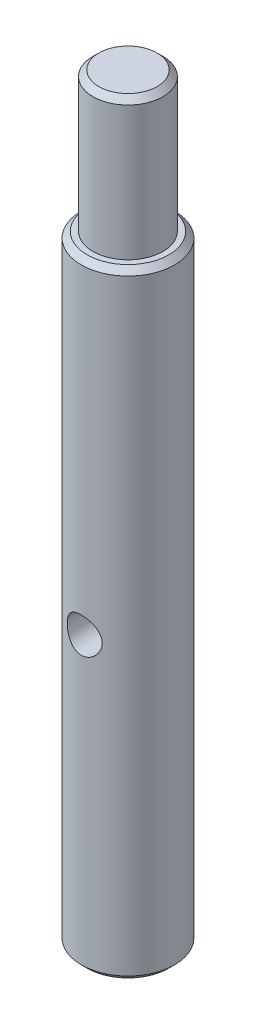
ISO-10303-21;
HEADER;
FILE_DESCRIPTION(('STEP AP214'),'2;1');
FILE_NAME('part.step','',(''),(''),'','','');
FILE_SCHEMA(('AUTOMOTIVE_DESIGN { 1 0 10303 214 1 1 1 1 }'));
ENDSEC;
DATA;
#1=APPLICATION_CONTEXT('core data for automotive mechanical design processes');
#2=APPLICATION_PROTOCOL_DEFINITION('international standard','automotive_design',2000,#1);
#3=PRODUCT_CONTEXT('',#1,'mechanical');
#4=PRODUCT('Part','Part','',(#3));
#5=PRODUCT_RELATED_PRODUCT_CATEGORY('part','',(#4));
#6=PRODUCT_DEFINITION_FORMATION('','',#4);
#7=PRODUCT_DEFINITION_CONTEXT('part definition',#1,'design');
#8=PRODUCT_DEFINITION('design','',#6,#7);
#9=PRODUCT_DEFINITION_SHAPE('','',#8);
#10=(LENGTH_UNIT() NAMED_UNIT(*) SI_UNIT(.MILLI.,.METRE.));
#11=(NAMED_UNIT(*) PLANE_ANGLE_UNIT() SI_UNIT($,.RADIAN.));
#12=(NAMED_UNIT(*) SI_UNIT($,.STERADIAN.) SOLID_ANGLE_UNIT());
#13=UNCERTAINTY_MEASURE_WITH_UNIT(LENGTH_MEASURE(1.E-05),#10,'distance_accuracy_value','');
#14=(GEOMETRIC_REPRESENTATION_CONTEXT(3) GLOBAL_UNCERTAINTY_ASSIGNED_CONTEXT((#13)) GLOBAL_UNIT_ASSIGNED_CONTEXT((#10,
#11,#12)) REPRESENTATION_CONTEXT('',''));
#15=CARTESIAN_POINT('',(0.,0.,0.));
#16=DIRECTION('',(0.,0.,1.));
#17=DIRECTION('',(1.,0.,0.));
#18=AXIS2_PLACEMENT_3D('',#15,#16,#17);
#19=CARTESIAN_POINT('',(0.,64.5,0.));
#20=DIRECTION('',(0.,1.,0.));
#21=DIRECTION('',(0.,0.,1.));
#22=AXIS2_PLACEMENT_3D('',#19,#20,#21);
#23=CYLINDRICAL_SURFACE('',#22,2.1);
#24=CARTESIAN_POINT('',(0.,53.,0.));
#25=DIRECTION('',(0.,1.,0.));
#26=DIRECTION('',(0.,0.,1.));
#27=AXIS2_PLACEMENT_3D('',#24,#25,#26);
#28=CIRCLE('',#27,2.1);
#29=CARTESIAN_POINT('',(0.,53.,2.1));
#30=VERTEX_POINT('',#29);
#31=EDGE_CURVE('P0_E20',#30,#30,#28,.T.);
#32=ORIENTED_EDGE('',*,*,#31,.T.);
#33=EDGE_LOOP('',(#32));
#34=FACE_BOUND('',#33,.T.);
#35=CARTESIAN_POINT('',(0.,64.5,0.));
#36=DIRECTION('',(0.,1.,0.));
#37=DIRECTION('',(0.,0.,1.));
#38=AXIS2_PLACEMENT_3D('',#35,#36,#37);
#39=CIRCLE('',#38,2.1);
#40=CARTESIAN_POINT('',(0.,64.5,2.1));
#41=VERTEX_POINT('',#40);
#42=EDGE_CURVE('P0_E11',#41,#41,#39,.F.);
#43=ORIENTED_EDGE('',*,*,#42,.T.);
#44=EDGE_LOOP('',(#43));
#45=FACE_BOUND('',#44,.T.);
#46=ADVANCED_FACE('P0_F16',(#34,#45),#23,.T.);
#47=CARTESIAN_POINT('',(0.,64.5,0.));
#48=DIRECTION('',(0.,1.,0.));
#49=DIRECTION('',(0.,0.,1.));
#50=AXIS2_PLACEMENT_3D('',#47,#48,#49);
#51=PLANE('',#50);
#52=ORIENTED_EDGE('',*,*,#42,.F.);
#53=EDGE_LOOP('',(#52));
#54=FACE_BOUND('',#53,.T.);
#55=CARTESIAN_POINT('',(-3.,64.5,0.));
#56=CARTESIAN_POINT('',(-2.99979758483912,64.5,0.572474592040133));
#57=CARTESIAN_POINT('',(-2.78936490318729,64.5,1.10428412868562));
#58=CARTESIAN_POINT('',(-2.56095382781985,64.5,1.68152900910221));
#59=CARTESIAN_POINT('',(-2.12132034355964,64.5,2.12132034355964));
#60=CARTESIAN_POINT('',(-1.68243191582807,64.5,2.56036635397624));
#61=CARTESIAN_POINT('',(-1.10428412868562,64.5,2.78936490318729));
#62=CARTESIAN_POINT('',(-0.572753802134978,64.5,2.99989874306132));
#63=CARTESIAN_POINT('',(0.,64.5,3.));
#64=CARTESIAN_POINT('',(0.571707613467384,64.5,3.00010107198336));
#65=CARTESIAN_POINT('',(1.10428412868562,64.5,2.78936490318729));
#66=CARTESIAN_POINT('',(1.68152900910127,64.5,2.56095382782079));
#67=CARTESIAN_POINT('',(2.12132034355964,64.5,2.12132034355964));
#68=CARTESIAN_POINT('',(2.56036635397624,64.5,1.68243191582807));
#69=CARTESIAN_POINT('',(2.78936490318729,64.5,1.10428412868562));
#70=CARTESIAN_POINT('',(2.999797395646,64.5,0.573009671807972));
#71=CARTESIAN_POINT('',(3.,64.5,0.));
#72=B_SPLINE_CURVE_WITH_KNOTS('',2,(#55,#56,#57,#58,#59,#60,#61,#62,#63,#64,#65,#66,#67,#68,#69,
#70,#71),.UNSPECIFIED.,.F.,.F.,(3,2,2,2,2,2,2,2,3),(0.,0.125,0.25,0.375,0.5,0.625,0.75,0.875,
1.),.UNSPECIFIED.);
#73=CARTESIAN_POINT('',(-3.,64.5,0.));
#74=VERTEX_POINT('',#73);
#75=CARTESIAN_POINT('',(3.,64.5,0.));
#76=VERTEX_POINT('',#75);
#77=EDGE_CURVE('P0_E29',#74,#76,#72,.T.);
#78=ORIENTED_EDGE('',*,*,#77,.F.);
#79=CARTESIAN_POINT('',(3.,64.5,0.));
#80=CARTESIAN_POINT('',(2.99979758483912,64.5,-0.572474592040133));
#81=CARTESIAN_POINT('',(2.78936490318729,64.5,-1.10428412868562));
#82=CARTESIAN_POINT('',(2.56095382781985,64.5,-1.68152900910221));
#83=CARTESIAN_POINT('',(2.12132034355964,64.5,-2.12132034355964));
#84=CARTESIAN_POINT('',(1.68243191582807,64.5,-2.56036635397624));
#85=CARTESIAN_POINT('',(1.10428412868562,64.5,-2.78936490318729));
#86=CARTESIAN_POINT('',(0.572753802134978,64.5,-2.99989874306132));
#87=CARTESIAN_POINT('',(0.,64.5,-3.));
#88=CARTESIAN_POINT('',(-0.571707613467384,64.5,-3.00010107198336));
#89=CARTESIAN_POINT('',(-1.10428412868562,64.5,-2.78936490318729));
#90=CARTESIAN_POINT('',(-1.68152900910127,64.5,-2.56095382782079));
#91=CARTESIAN_POINT('',(-2.12132034355964,64.5,-2.12132034355964));
#92=CARTESIAN_POINT('',(-2.56036635397624,64.5,-1.68243191582807));
#93=CARTESIAN_POINT('',(-2.78936490318729,64.5,-1.10428412868562));
#94=CARTESIAN_POINT('',(-2.999797395646,64.5,-0.573009671807972));
#95=CARTESIAN_POINT('',(-3.,64.5,0.));
#96=B_SPLINE_CURVE_WITH_KNOTS('',2,(#79,#80,#81,#82,#83,#84,#85,#86,#87,#88,#89,#90,#91,#92,#93,
#94,#95),.UNSPECIFIED.,.F.,.F.,(3,2,2,2,2,2,2,2,3),(0.,0.125,0.25,0.375,0.5,0.625,0.75,0.875,
1.),.UNSPECIFIED.);
#97=EDGE_CURVE('P0_E48',#76,#74,#96,.T.);
#98=ORIENTED_EDGE('',*,*,#97,.F.);
#99=EDGE_LOOP('',(#78,#98));
#100=FACE_BOUND('',#99,.T.);
#101=ADVANCED_FACE('P0_F67',(#54,#100),#51,.F.);
#102=CARTESIAN_POINT('',(0.,53.,0.));
#103=DIRECTION('',(0.,1.,0.));
#104=DIRECTION('',(0.,0.,1.));
#105=AXIS2_PLACEMENT_3D('',#102,#103,#104);
#106=PLANE('',#105);
#107=ORIENTED_EDGE('',*,*,#31,.F.);
#108=EDGE_LOOP('',(#107));
#109=FACE_BOUND('',#108,.T.);
#110=CARTESIAN_POINT('',(3.,53.,0.));
#111=CARTESIAN_POINT('',(2.99979758483912,53.,-0.572474592038812));
#112=CARTESIAN_POINT('',(2.78936490318729,53.,-1.10428412868562));
#113=CARTESIAN_POINT('',(2.56095382782096,53.,-1.68152900910086));
#114=CARTESIAN_POINT('',(2.12132034355964,53.,-2.12132034355964));
#115=CARTESIAN_POINT('',(1.68243191582797,53.,-2.56036635397659));
#116=CARTESIAN_POINT('',(1.10428412868562,53.,-2.78936490318729));
#117=CARTESIAN_POINT('',(0.572753802134251,53.,-2.99989874306132));
#118=CARTESIAN_POINT('',(0.,53.,-3.));
#119=CARTESIAN_POINT('',(-0.571707613467504,53.,-3.00010107198336));
#120=CARTESIAN_POINT('',(-1.10428412868562,53.,-2.78936490318729));
#121=CARTESIAN_POINT('',(-1.68152900910094,53.,-2.56095382782087));
#122=CARTESIAN_POINT('',(-2.12132034355964,53.,-2.12132034355964));
#123=CARTESIAN_POINT('',(-2.56036635397764,53.,-1.68243191582692));
#124=CARTESIAN_POINT('',(-2.78936490318729,53.,-1.10428412868562));
#125=CARTESIAN_POINT('',(-2.999797395646,53.,-0.573009671805779));
#126=CARTESIAN_POINT('',(-3.,53.,0.));
#127=B_SPLINE_CURVE_WITH_KNOTS('',2,(#110,#111,#112,#113,#114,#115,#116,#117,#118,#119,#120,
#121,#122,#123,#124,#125,#126),.UNSPECIFIED.,.F.,.F.,(3,2,2,2,2,2,2,2,3),(0.,0.125,0.25,0.375,
0.5,0.625,0.75,0.875,1.),.UNSPECIFIED.);
#128=CARTESIAN_POINT('',(3.,53.,0.));
#129=VERTEX_POINT('',#128);
#130=CARTESIAN_POINT('',(-3.,53.,0.));
#131=VERTEX_POINT('',#130);
#132=EDGE_CURVE('P0_E35',#129,#131,#127,.T.);
#133=ORIENTED_EDGE('',*,*,#132,.T.);
#134=CARTESIAN_POINT('',(-3.,53.,0.));
#135=CARTESIAN_POINT('',(-2.99979758483912,53.,0.572474592038812));
#136=CARTESIAN_POINT('',(-2.78936490318729,53.,1.10428412868562));
#137=CARTESIAN_POINT('',(-2.56095382782096,53.,1.68152900910086));
#138=CARTESIAN_POINT('',(-2.12132034355964,53.,2.12132034355964));
#139=CARTESIAN_POINT('',(-1.68243191582797,53.,2.56036635397659));
#140=CARTESIAN_POINT('',(-1.10428412868562,53.,2.78936490318729));
#141=CARTESIAN_POINT('',(-0.572753802134251,53.,2.99989874306132));
#142=CARTESIAN_POINT('',(0.,53.,3.));
#143=CARTESIAN_POINT('',(0.571707613467504,53.,3.00010107198336));
#144=CARTESIAN_POINT('',(1.10428412868562,53.,2.78936490318729));
#145=CARTESIAN_POINT('',(1.68152900910094,53.,2.56095382782087));
#146=CARTESIAN_POINT('',(2.12132034355964,53.,2.12132034355964));
#147=CARTESIAN_POINT('',(2.56036635397764,53.,1.68243191582692));
#148=CARTESIAN_POINT('',(2.78936490318729,53.,1.10428412868562));
#149=CARTESIAN_POINT('',(2.999797395646,53.,0.573009671805779));
#150=CARTESIAN_POINT('',(3.,53.,0.));
#151=B_SPLINE_CURVE_WITH_KNOTS('',2,(#134,#135,#136,#137,#138,#139,#140,#141,#142,#143,#144,
#145,#146,#147,#148,#149,#150),.UNSPECIFIED.,.F.,.F.,(3,2,2,2,2,2,2,2,3),(0.,0.125,0.25,0.375,
0.5,0.625,0.75,0.875,1.),.UNSPECIFIED.);
#152=EDGE_CURVE('P0_E39',#131,#129,#151,.T.);
#153=ORIENTED_EDGE('',*,*,#152,.T.);
#154=EDGE_LOOP('',(#133,#153));
#155=FACE_BOUND('',#154,.T.);
#156=ADVANCED_FACE('P0_F17',(#109,#155),#106,.T.);
#157=OPEN_SHELL('',(#46,#101,#156));
#158=SHELL_BASED_SURFACE_MODEL('P0_B1',(#157));
#159=CARTESIAN_POINT('',(0.,65.,0.));
#160=DIRECTION('',(0.,1.,0.));
#161=DIRECTION('',(0.,0.,1.));
#162=AXIS2_PLACEMENT_3D('',#159,#160,#161);
#163=PLANE('',#162);
#164=CARTESIAN_POINT('',(0.,64.9999999999409,0.));
#165=DIRECTION('',(0.,-1.,0.));
#166=DIRECTION('',(0.,0.,-1.));
#167=AXIS2_PLACEMENT_3D('',#164,#165,#166);
#168=CIRCLE('',#167,2.49999999999773);
#169=CARTESIAN_POINT('',(0.,64.9999999999409,-2.49999999999773));
#170=VERTEX_POINT('',#169);
#171=EDGE_CURVE('P1_E19',#170,#170,#168,.T.);
#172=ORIENTED_EDGE('',*,*,#171,.F.);
#173=EDGE_LOOP('',(#172));
#174=FACE_BOUND('',#173,.T.);
#175=ADVANCED_FACE('P1_F16',(#174),#163,.T.);
#176=CARTESIAN_POINT('',(0.,10.0999999999658,0.));
#177=DIRECTION('',(0.,-1.,0.));
#178=DIRECTION('',(0.,0.,-1.));
#179=AXIS2_PLACEMENT_3D('',#176,#177,#178);
#180=CONICAL_SURFACE('',#179,2.24999999994679,1.02974425867671);
#181=CARTESIAN_POINT('',(0.,10.1,0.));
#182=DIRECTION('',(0.,-1.,0.));
#183=DIRECTION('',(0.,0.,-1.));
#184=AXIS2_PLACEMENT_3D('',#181,#182,#183);
#185=CIRCLE('',#184,2.25);
#186=CARTESIAN_POINT('',(0.,10.1,-2.25));
#187=VERTEX_POINT('',#186);
#188=EDGE_CURVE('P1_E82',#187,#187,#185,.T.);
#189=ORIENTED_EDGE('',*,*,#188,.T.);
#190=EDGE_LOOP('',(#189));
#191=FACE_BOUND('',#190,.T.);
#192=CARTESIAN_POINT('',(-5.6843418860808E-11,11.4519363927741,0.));
#193=VERTEX_POINT('',#192);
#194=VERTEX_LOOP('',#193);
#195=FACE_BOUND('',#194,.T.);
#196=ADVANCED_FACE('P1_F27',(#191,#195),#180,.F.);
#197=CARTESIAN_POINT('',(0.,64.5000000000095,0.));
#198=DIRECTION('',(0.,-1.,0.));
#199=DIRECTION('',(0.,0.,-1.));
#200=AXIS2_PLACEMENT_3D('',#197,#198,#199);
#201=CONICAL_SURFACE('',#200,2.99999999992906,0.785398163397448);
#202=CARTESIAN_POINT('',(0.,64.5,0.));
#203=DIRECTION('',(0.,1.,0.));
#204=DIRECTION('',(0.,0.,1.));
#205=AXIS2_PLACEMENT_3D('',#202,#203,#204);
#206=CIRCLE('',#205,3.);
#207=CARTESIAN_POINT('',(0.,64.5,3.));
#208=VERTEX_POINT('',#207);
#209=EDGE_CURVE('P1_E78',#208,#208,#206,.F.);
#210=ORIENTED_EDGE('',*,*,#209,.F.);
#211=EDGE_LOOP('',(#210));
#212=FACE_BOUND('',#211,.T.);
#213=ORIENTED_EDGE('',*,*,#171,.T.);
#214=EDGE_LOOP('',(#213));
#215=FACE_BOUND('',#214,.T.);
#216=ADVANCED_FACE('P1_F29',(#212,#215),#201,.T.);
#217=CARTESIAN_POINT('',(0.,12.02453321245,0.));
#218=DIRECTION('',(0.,-1.,0.));
#219=DIRECTION('',(0.,0.,-1.));
#220=AXIS2_PLACEMENT_3D('',#217,#218,#219);
#221=CYLINDRICAL_SURFACE('',#220,2.25);
#222=ORIENTED_EDGE('',*,*,#188,.F.);
#223=EDGE_LOOP('',(#222));
#224=FACE_BOUND('',#223,.T.);
#225=CARTESIAN_POINT('',(0.,0.,0.));
#226=DIRECTION('',(0.,-1.,0.));
#227=DIRECTION('',(0.,0.,-1.));
#228=AXIS2_PLACEMENT_3D('',#225,#226,#227);
#229=CIRCLE('',#228,2.25);
#230=CARTESIAN_POINT('',(0.,0.,-2.25));
#231=VERTEX_POINT('',#230);
#232=EDGE_CURVE('P1_E76',#231,#231,#229,.T.);
#233=ORIENTED_EDGE('',*,*,#232,.T.);
#234=EDGE_LOOP('',(#233));
#235=FACE_BOUND('',#234,.T.);
#236=ADVANCED_FACE('P1_F36',(#224,#235),#221,.F.);
#237=CARTESIAN_POINT('',(0.,65.,0.));
#238=DIRECTION('',(0.,1.,0.));
#239=DIRECTION('',(0.,0.,1.));
#240=AXIS2_PLACEMENT_3D('',#237,#238,#239);
#241=CYLINDRICAL_SURFACE('',#240,3.);
#242=CARTESIAN_POINT('',(0.,53.,0.));
#243=DIRECTION('',(0.,1.,0.));
#244=DIRECTION('',(0.,0.,1.));
#245=AXIS2_PLACEMENT_3D('',#242,#243,#244);
#246=CIRCLE('',#245,3.);
#247=CARTESIAN_POINT('',(0.,53.,3.));
#248=VERTEX_POINT('',#247);
#249=EDGE_CURVE('P1_E74',#248,#248,#246,.F.);
#250=ORIENTED_EDGE('',*,*,#249,.F.);
#251=EDGE_LOOP('',(#250));
#252=FACE_BOUND('',#251,.T.);
#253=ORIENTED_EDGE('',*,*,#209,.T.);
#254=EDGE_LOOP('',(#253));
#255=FACE_BOUND('',#254,.T.);
#256=ADVANCED_FACE('P1_F100',(#252,#255),#241,.T.);
#257=CARTESIAN_POINT('',(0.,0.,0.));
#258=DIRECTION('',(0.,1.,0.));
#259=DIRECTION('',(0.,0.,1.));
#260=AXIS2_PLACEMENT_3D('',#257,#258,#259);
#261=PLANE('',#260);
#262=ORIENTED_EDGE('',*,*,#232,.F.);
#263=EDGE_LOOP('',(#262));
#264=FACE_BOUND('',#263,.T.);
#265=CARTESIAN_POINT('',(0.,5.6843418860808E-11,0.));
#266=DIRECTION('',(0.,1.,0.));
#267=DIRECTION('',(0.,0.,1.));
#268=AXIS2_PLACEMENT_3D('',#265,#266,#267);
#269=CIRCLE('',#268,3.50000000008777);
#270=CARTESIAN_POINT('',(0.,5.6843418860808E-11,3.50000000008777));
#271=VERTEX_POINT('',#270);
#272=EDGE_CURVE('P1_E71',#271,#271,#269,.T.);
#273=ORIENTED_EDGE('',*,*,#272,.F.);
#274=EDGE_LOOP('',(#273));
#275=FACE_BOUND('',#274,.T.);
#276=ADVANCED_FACE('P1_F98',(#264,#275),#261,.F.);
#277=CARTESIAN_POINT('',(0.,53.,0.));
#278=DIRECTION('',(0.,1.,0.));
#279=DIRECTION('',(0.,0.,1.));
#280=AXIS2_PLACEMENT_3D('',#277,#278,#279);
#281=PLANE('',#280);
#282=ORIENTED_EDGE('',*,*,#249,.T.);
#283=EDGE_LOOP('',(#282));
#284=FACE_BOUND('',#283,.T.);
#285=CARTESIAN_POINT('',(0.,52.9999999999973,0.));
#286=DIRECTION('',(0.,-1.,0.));
#287=DIRECTION('',(0.,0.,-1.));
#288=AXIS2_PLACEMENT_3D('',#285,#286,#287);
#289=CIRCLE('',#288,3.50000000003092);
#290=CARTESIAN_POINT('',(0.,52.9999999999973,-3.50000000003092));
#291=VERTEX_POINT('',#290);
#292=EDGE_CURVE('P1_E68',#291,#291,#289,.T.);
#293=ORIENTED_EDGE('',*,*,#292,.F.);
#294=EDGE_LOOP('',(#293));
#295=FACE_BOUND('',#294,.T.);
#296=ADVANCED_FACE('P1_F94',(#284,#295),#281,.T.);
#297=CARTESIAN_POINT('',(0.,0.499999998851308,0.));
#298=DIRECTION('',(0.,1.,0.));
#299=DIRECTION('',(0.,0.,1.));
#300=AXIS2_PLACEMENT_3D('',#297,#298,#299);
#301=CONICAL_SURFACE('',#300,3.99999999888223,0.785398163397448);
#302=CARTESIAN_POINT('',(0.,0.4999999989309,0.));
#303=DIRECTION('',(0.,1.,0.));
#304=DIRECTION('',(0.,0.,1.));
#305=AXIS2_PLACEMENT_3D('',#302,#303,#304);
#306=CIRCLE('',#305,4.);
#307=CARTESIAN_POINT('',(0.,0.4999999989309,4.));
#308=VERTEX_POINT('',#307);
#309=EDGE_CURVE('P1_E67',#308,#308,#306,.T.);
#310=ORIENTED_EDGE('',*,*,#309,.F.);
#311=EDGE_LOOP('',(#310));
#312=FACE_BOUND('',#311,.T.);
#313=ORIENTED_EDGE('',*,*,#272,.T.);
#314=EDGE_LOOP('',(#313));
#315=FACE_BOUND('',#314,.T.);
#316=ADVANCED_FACE('P1_F91',(#312,#315),#301,.T.);
#317=CARTESIAN_POINT('',(0.,52.5000000001228,0.));
#318=DIRECTION('',(0.,-1.,0.));
#319=DIRECTION('',(0.,0.,-1.));
#320=AXIS2_PLACEMENT_3D('',#317,#318,#319);
#321=CONICAL_SURFACE('',#320,3.99999999990541,0.785398163397448);
#322=ORIENTED_EDGE('',*,*,#292,.T.);
#323=EDGE_LOOP('',(#322));
#324=FACE_BOUND('',#323,.T.);
#325=CARTESIAN_POINT('',(0.,52.5,0.));
#326=DIRECTION('',(0.,1.,0.));
#327=DIRECTION('',(0.,0.,1.));
#328=AXIS2_PLACEMENT_3D('',#325,#326,#327);
#329=CIRCLE('',#328,4.);
#330=CARTESIAN_POINT('',(0.,52.5,4.));
#331=VERTEX_POINT('',#330);
#332=EDGE_CURVE('P1_E23',#331,#331,#329,.F.);
#333=ORIENTED_EDGE('',*,*,#332,.F.);
#334=EDGE_LOOP('',(#333));
#335=FACE_BOUND('',#334,.T.);
#336=ADVANCED_FACE('P1_F49',(#324,#335),#321,.T.);
#337=CARTESIAN_POINT('',(0.,25.,4.));
#338=DIRECTION('',(0.,0.,-1.));
#339=DIRECTION('',(-1.,0.,0.));
#340=AXIS2_PLACEMENT_3D('',#337,#338,#339);
#341=CYLINDRICAL_SURFACE('',#340,1.5);
#342=CARTESIAN_POINT('',(-1.5,25.,3.70809924354783));
#343=CARTESIAN_POINT('',(-1.49999511198562,25.0808856815842,3.70810390468995));
#344=CARTESIAN_POINT('',(-1.49342462043817,25.1618484052092,3.71078017486277));
#345=CARTESIAN_POINT('',(-1.46739553122329,25.321415586283,3.72114716574756));
#346=CARTESIAN_POINT('',(-1.44791647247549,25.4000160923335,3.72884584706871));
#347=CARTESIAN_POINT('',(-1.39689210182249,25.5523831089441,3.74825681504278));
#348=CARTESIAN_POINT('',(-1.36538366315583,25.6261635926785,3.75995682525136));
#349=CARTESIAN_POINT('',(-1.29130569359819,25.7673936044528,3.78603559884647));
#350=CARTESIAN_POINT('',(-1.24873621383727,25.8348431617557,3.80041434985032));
#351=CARTESIAN_POINT('',(-1.1514676407667,25.964888573723,3.83103545050313));
#352=CARTESIAN_POINT('',(-1.09630616188792,26.0271257844757,3.84733273300532));
#353=CARTESIAN_POINT('',(-0.976398614974301,26.1417206621388,3.87949681773074));
#354=CARTESIAN_POINT('',(-0.911650100405856,26.1940757994436,3.89536350884397));
#355=CARTESIAN_POINT('',(-0.771694621328188,26.2891395101715,3.92552874918008));
#356=CARTESIAN_POINT('',(-0.696206884645209,26.3314595033803,3.93975562475051));
#357=CARTESIAN_POINT('',(-0.538555706333357,26.402651201907,3.9643800872777));
#358=CARTESIAN_POINT('',(-0.456394597048803,26.431527582218,3.97477900513638));
#359=CARTESIAN_POINT('',(-0.291489314135701,26.4737579013459,3.9901869737988));
#360=CARTESIAN_POINT('',(-0.208923141284651,26.4877276368241,3.99540915570892));
#361=CARTESIAN_POINT('',(-0.0424643069478187,26.5017212010518,4.00064014106762));
#362=CARTESIAN_POINT('',(0.0414279133905617,26.5017495740492,4.00065064328596));
#363=CARTESIAN_POINT('',(0.203743429413647,26.4882182491575,3.99559266256176));
#364=CARTESIAN_POINT('',(0.282231952477409,26.4753307436436,3.99077543371971));
#365=CARTESIAN_POINT('',(0.435839001660108,26.4374641521752,3.97693277540875));
#366=CARTESIAN_POINT('',(0.510957279027463,26.4124841752968,3.96790703587578));
#367=CARTESIAN_POINT('',(0.656990622215187,26.3508288874906,3.94637745432581));
#368=CARTESIAN_POINT('',(0.72782848402618,26.3139884496949,3.93382484396379));
#369=CARTESIAN_POINT('',(0.862489409870148,26.2298057634355,3.90651245754908));
#370=CARTESIAN_POINT('',(0.92631050913665,26.1824605846788,3.8917520660119));
#371=CARTESIAN_POINT('',(1.04908093630972,26.0753812874176,3.86052771527365));
#372=CARTESIAN_POINT('',(1.1075284050676,26.0150853054084,3.84401460840428));
#373=CARTESIAN_POINT('',(1.21368958697561,25.8854270031139,3.81182937208832));
#374=CARTESIAN_POINT('',(1.26139735324323,25.816059693215,3.79615771221437));
#375=CARTESIAN_POINT('',(1.34568993912002,25.6682245048253,3.76711519922767));
#376=CARTESIAN_POINT('',(1.38199556964104,25.589584842883,3.75380512939464));
#377=CARTESIAN_POINT('',(1.44060169661363,25.4267540711373,3.73171052411887));
#378=CARTESIAN_POINT('',(1.46293219796961,25.342575286695,3.72291630039947));
#379=CARTESIAN_POINT('',(1.48518920410794,25.214638944686,3.71406329828307));
#380=CARTESIAN_POINT('',(1.49073488518211,25.1719380994954,3.71183587263098));
#381=CARTESIAN_POINT('',(1.49814158486026,25.0861654588583,3.7088526037461));
#382=CARTESIAN_POINT('',(1.50000260419944,25.0430936634857,3.70809676021968));
#383=CARTESIAN_POINT('',(1.49999511198562,24.9191143184158,3.70810390468995));
#384=CARTESIAN_POINT('',(1.49342462043817,24.8381515947908,3.71078017486277));
#385=CARTESIAN_POINT('',(1.46739553122329,24.678584413717,3.72114716574756));
#386=CARTESIAN_POINT('',(1.44791647247549,24.5999839076665,3.72884584706871));
#387=CARTESIAN_POINT('',(1.39689210182249,24.4476168910559,3.74825681504278));
#388=CARTESIAN_POINT('',(1.36538366315583,24.3738364073215,3.75995682525136));
#389=CARTESIAN_POINT('',(1.29130569359818,24.2326063955472,3.78603559884647));
#390=CARTESIAN_POINT('',(1.24873621383727,24.1651568382443,3.80041434985032));
#391=CARTESIAN_POINT('',(1.1514676407667,24.035111426277,3.83103545050313));
#392=CARTESIAN_POINT('',(1.09630616188792,23.9728742155243,3.84733273300532));
#393=CARTESIAN_POINT('',(0.976398614974301,23.8582793378612,3.87949681773074));
#394=CARTESIAN_POINT('',(0.911650100405855,23.8059242005564,3.89536350884397));
#395=CARTESIAN_POINT('',(0.771694621328188,23.7108604898285,3.92552874918008));
#396=CARTESIAN_POINT('',(0.696206884645209,23.6685404966197,3.93975562475051));
#397=CARTESIAN_POINT('',(0.538555706333356,23.597348798093,3.9643800872777));
#398=CARTESIAN_POINT('',(0.456394597048802,23.568472417782,3.97477900513638));
#399=CARTESIAN_POINT('',(0.291489314135701,23.5262420986541,3.9901869737988));
#400=CARTESIAN_POINT('',(0.208923141284651,23.5122723631759,3.99540915570892));
#401=CARTESIAN_POINT('',(0.0424643069478187,23.4982787989482,4.00064014106762));
#402=CARTESIAN_POINT('',(-0.0414279133905617,23.4982504259508,4.00065064328596));
#403=CARTESIAN_POINT('',(-0.203743429413647,23.5117817508425,3.99559266256176));
#404=CARTESIAN_POINT('',(-0.282231952477409,23.5246692563564,3.99077543371971));
#405=CARTESIAN_POINT('',(-0.435839001660108,23.5625358478248,3.97693277540875));
#406=CARTESIAN_POINT('',(-0.510957279027463,23.5875158247032,3.96790703587578));
#407=CARTESIAN_POINT('',(-0.656990622215187,23.6491711125094,3.94637745432581));
#408=CARTESIAN_POINT('',(-0.727828484026181,23.6860115503051,3.93382484396378));
#409=CARTESIAN_POINT('',(-0.862489409870149,23.7701942365645,3.90651245754908));
#410=CARTESIAN_POINT('',(-0.926310509136651,23.8175394153212,3.8917520660119));
#411=CARTESIAN_POINT('',(-1.04908093630972,23.9246187125824,3.86052771527365));
#412=CARTESIAN_POINT('',(-1.1075284050676,23.9849146945916,3.84401460840428));
#413=CARTESIAN_POINT('',(-1.21368958697561,24.1145729968861,3.81182937208832));
#414=CARTESIAN_POINT('',(-1.26139735324323,24.183940306785,3.79615771221437));
#415=CARTESIAN_POINT('',(-1.34568993912002,24.3317754951747,3.76711519922767));
#416=CARTESIAN_POINT('',(-1.38199556964104,24.410415157117,3.75380512939463));
#417=CARTESIAN_POINT('',(-1.44060169661363,24.5732459288627,3.73171052411887));
#418=CARTESIAN_POINT('',(-1.46293219796961,24.6574247133051,3.72291630039947));
#419=CARTESIAN_POINT('',(-1.48518920410794,24.785361055314,3.71406329828307));
#420=CARTESIAN_POINT('',(-1.49073488518211,24.8280619005046,3.71183587263098));
#421=CARTESIAN_POINT('',(-1.49814158486026,24.9138345411417,3.7088526037461));
#422=CARTESIAN_POINT('',(-1.50000260419944,24.9569063365143,3.70809676021968));
#423=CARTESIAN_POINT('',(-1.5,25.,3.70809924354783));
#424=B_SPLINE_CURVE_WITH_KNOTS('',3,(#342,#343,#344,#345,#346,#347,#348,#349,#350,#351,#352,
#353,#354,#355,#356,#357,#358,#359,#360,#361,#362,#363,#364,#365,#366,#367,#368,#369,#370,#371,
#372,#373,#374,#375,#376,#377,#378,#379,#380,#381,#382,#383,#384,#385,#386,#387,#388,#389,#390,
#391,#392,#393,#394,#395,#396,#397,#398,#399,#400,#401,#402,#403,#404,#405,#406,#407,#408,#409,
#410,#411,#412,#413,#414,#415,#416,#417,#418,#419,#420,#421,#422,#423),.UNSPECIFIED.,.T.,.F.,(4,
2,2,2,2,2,2,2,2,2,2,2,2,2,2,2,2,2,2,2,2,2,2,2,2,2,2,2,2,2,2,2,2,2,2,2,2,2,2,2,4),(0.,
0.242488275572684,0.485361836176221,0.727496825725533,0.969630696016732,1.2227411485105,
1.47591630441611,1.73770084383829,1.99939428001787,2.24980028562969,2.50012467025743,
2.73806440302077,2.97602166888029,3.21744659529709,3.45893895195248,3.71452823140489,
3.9702586917696,4.23183490868752,4.49284757156316,4.62203867222691,4.75122974711301,
4.9937180226857,5.23659158328924,5.47872657283855,5.72086044312975,5.97397089562352,
6.22714605152912,6.4889305909513,6.75062402713088,7.0010300327427,7.25135441737044,
7.48929415013378,7.7272514159933,7.96867634241011,8.21016869906549,8.4657579785179,
8.72148843888261,8.98306465580054,9.24407731867618,9.37326841933992,9.50245949422603),.UNSPECIFIED.);
#425=CARTESIAN_POINT('',(-1.5,25.,3.70809924354783));
#426=VERTEX_POINT('',#425);
#427=EDGE_CURVE('P1_E62',#426,#426,#424,.T.);
#428=ORIENTED_EDGE('',*,*,#427,.F.);
#429=EDGE_LOOP('',(#428));
#430=FACE_BOUND('',#429,.T.);
#431=CARTESIAN_POINT('',(-1.5,25.,-3.70809924354783));
#432=CARTESIAN_POINT('',(-1.49999511198562,24.9191143184158,-3.70810390468995));
#433=CARTESIAN_POINT('',(-1.49342462043817,24.8381515947908,-3.71078017486277));
#434=CARTESIAN_POINT('',(-1.46739553122329,24.678584413717,-3.72114716574755));
#435=CARTESIAN_POINT('',(-1.44791647247549,24.5999839076665,-3.72884584706871));
#436=CARTESIAN_POINT('',(-1.39689210182249,24.4476168910559,-3.74825681504277));
#437=CARTESIAN_POINT('',(-1.36538366315583,24.3738364073215,-3.75995682525136));
#438=CARTESIAN_POINT('',(-1.29130569359819,24.2326063955472,-3.78603559884647));
#439=CARTESIAN_POINT('',(-1.24873621383727,24.1651568382443,-3.80041434985032));
#440=CARTESIAN_POINT('',(-1.1514676407667,24.035111426277,-3.83103545050313));
#441=CARTESIAN_POINT('',(-1.09630616188792,23.9728742155243,-3.84733273300532));
#442=CARTESIAN_POINT('',(-0.9763986149743,23.8582793378612,-3.87949681773074));
#443=CARTESIAN_POINT('',(-0.911650100405854,23.8059242005564,-3.89536350884397));
#444=CARTESIAN_POINT('',(-0.771694621328186,23.7108604898285,-3.92552874918008));
#445=CARTESIAN_POINT('',(-0.696206884645208,23.6685404966197,-3.93975562475051));
#446=CARTESIAN_POINT('',(-0.538555706333356,23.597348798093,-3.9643800872777));
#447=CARTESIAN_POINT('',(-0.456394597048802,23.568472417782,-3.97477900513638));
#448=CARTESIAN_POINT('',(-0.2914893141357,23.5262420986541,-3.9901869737988));
#449=CARTESIAN_POINT('',(-0.208923141284651,23.5122723631759,-3.99540915570892));
#450=CARTESIAN_POINT('',(-0.0424643069478185,23.4982787989482,-4.00064014106763));
#451=CARTESIAN_POINT('',(0.041427913390562,23.4982504259508,-4.00065064328596));
#452=CARTESIAN_POINT('',(0.203743429413647,23.5117817508425,-3.99559266256176));
#453=CARTESIAN_POINT('',(0.28223195247741,23.5246692563564,-3.9907754337197));
#454=CARTESIAN_POINT('',(0.435839001660109,23.5625358478248,-3.97693277540875));
#455=CARTESIAN_POINT('',(0.510957279027463,23.5875158247032,-3.96790703587578));
#456=CARTESIAN_POINT('',(0.656990622215187,23.6491711125094,-3.94637745432581));
#457=CARTESIAN_POINT('',(0.72782848402618,23.6860115503051,-3.93382484396378));
#458=CARTESIAN_POINT('',(0.862489409870148,23.7701942365645,-3.90651245754908));
#459=CARTESIAN_POINT('',(0.92631050913665,23.8175394153212,-3.8917520660119));
#460=CARTESIAN_POINT('',(1.04908093630972,23.9246187125824,-3.86052771527365));
#461=CARTESIAN_POINT('',(1.1075284050676,23.9849146945916,-3.84401460840428));
#462=CARTESIAN_POINT('',(1.21368958697561,24.1145729968861,-3.81182937208832));
#463=CARTESIAN_POINT('',(1.26139735324323,24.183940306785,-3.79615771221437));
#464=CARTESIAN_POINT('',(1.34568993912002,24.3317754951747,-3.76711519922767));
#465=CARTESIAN_POINT('',(1.38199556964104,24.410415157117,-3.75380512939464));
#466=CARTESIAN_POINT('',(1.44060169661363,24.5732459288627,-3.73171052411887));
#467=CARTESIAN_POINT('',(1.46293219796961,24.6574247133051,-3.72291630039947));
#468=CARTESIAN_POINT('',(1.48518920410794,24.785361055314,-3.71406329828307));
#469=CARTESIAN_POINT('',(1.49073488518211,24.8280619005046,-3.71183587263098));
#470=CARTESIAN_POINT('',(1.49814158486026,24.9138345411417,-3.7088526037461));
#471=CARTESIAN_POINT('',(1.50000260419944,24.9569063365143,-3.70809676021968));
#472=CARTESIAN_POINT('',(1.49999511198562,25.0808856815842,-3.70810390468995));
#473=CARTESIAN_POINT('',(1.49342462043817,25.1618484052092,-3.71078017486277));
#474=CARTESIAN_POINT('',(1.46739553122329,25.321415586283,-3.72114716574755));
#475=CARTESIAN_POINT('',(1.44791647247549,25.4000160923335,-3.72884584706871));
#476=CARTESIAN_POINT('',(1.39689210182249,25.5523831089441,-3.74825681504277));
#477=CARTESIAN_POINT('',(1.36538366315583,25.6261635926785,-3.75995682525136));
#478=CARTESIAN_POINT('',(1.29130569359819,25.7673936044528,-3.78603559884647));
#479=CARTESIAN_POINT('',(1.24873621383727,25.8348431617557,-3.80041434985032));
#480=CARTESIAN_POINT('',(1.1514676407667,25.964888573723,-3.83103545050313));
#481=CARTESIAN_POINT('',(1.09630616188792,26.0271257844757,-3.84733273300532));
#482=CARTESIAN_POINT('',(0.9763986149743,26.1417206621388,-3.87949681773074));
#483=CARTESIAN_POINT('',(0.911650100405854,26.1940757994436,-3.89536350884397));
#484=CARTESIAN_POINT('',(0.771694621328186,26.2891395101715,-3.92552874918008));
#485=CARTESIAN_POINT('',(0.696206884645208,26.3314595033803,-3.93975562475051));
#486=CARTESIAN_POINT('',(0.538555706333356,26.402651201907,-3.9643800872777));
#487=CARTESIAN_POINT('',(0.456394597048802,26.431527582218,-3.97477900513638));
#488=CARTESIAN_POINT('',(0.2914893141357,26.4737579013459,-3.9901869737988));
#489=CARTESIAN_POINT('',(0.20892314128465,26.4877276368241,-3.99540915570892));
#490=CARTESIAN_POINT('',(0.042464306947818,26.5017212010518,-4.00064014106762));
#491=CARTESIAN_POINT('',(-0.0414279133905622,26.5017495740492,-4.00065064328596));
#492=CARTESIAN_POINT('',(-0.203743429413647,26.4882182491575,-3.99559266256176));
#493=CARTESIAN_POINT('',(-0.28223195247741,26.4753307436436,-3.9907754337197));
#494=CARTESIAN_POINT('',(-0.435839001660109,26.4374641521752,-3.97693277540875));
#495=CARTESIAN_POINT('',(-0.510957279027463,26.4124841752968,-3.96790703587578));
#496=CARTESIAN_POINT('',(-0.656990622215187,26.3508288874906,-3.94637745432581));
#497=CARTESIAN_POINT('',(-0.72782848402618,26.3139884496949,-3.93382484396378));
#498=CARTESIAN_POINT('',(-0.862489409870148,26.2298057634355,-3.90651245754908));
#499=CARTESIAN_POINT('',(-0.92631050913665,26.1824605846788,-3.8917520660119));
#500=CARTESIAN_POINT('',(-1.04908093630972,26.0753812874176,-3.86052771527365));
#501=CARTESIAN_POINT('',(-1.1075284050676,26.0150853054084,-3.84401460840428));
#502=CARTESIAN_POINT('',(-1.21368958697561,25.8854270031139,-3.81182937208832));
#503=CARTESIAN_POINT('',(-1.26139735324323,25.816059693215,-3.79615771221437));
#504=CARTESIAN_POINT('',(-1.34568993912002,25.6682245048253,-3.76711519922767));
#505=CARTESIAN_POINT('',(-1.38199556964104,25.589584842883,-3.75380512939463));
#506=CARTESIAN_POINT('',(-1.44060169661363,25.4267540711373,-3.73171052411887));
#507=CARTESIAN_POINT('',(-1.46293219796961,25.342575286695,-3.72291630039947));
#508=CARTESIAN_POINT('',(-1.48518920410794,25.214638944686,-3.71406329828307));
#509=CARTESIAN_POINT('',(-1.49073488518211,25.1719380994954,-3.71183587263098));
#510=CARTESIAN_POINT('',(-1.49814158486026,25.0861654588583,-3.7088526037461));
#511=CARTESIAN_POINT('',(-1.50000260419944,25.0430936634857,-3.70809676021968));
#512=CARTESIAN_POINT('',(-1.5,25.,-3.70809924354783));
#513=B_SPLINE_CURVE_WITH_KNOTS('',3,(#431,#432,#433,#434,#435,#436,#437,#438,#439,#440,#441,
#442,#443,#444,#445,#446,#447,#448,#449,#450,#451,#452,#453,#454,#455,#456,#457,#458,#459,#460,
#461,#462,#463,#464,#465,#466,#467,#468,#469,#470,#471,#472,#473,#474,#475,#476,#477,#478,#479,
#480,#481,#482,#483,#484,#485,#486,#487,#488,#489,#490,#491,#492,#493,#494,#495,#496,#497,#498,
#499,#500,#501,#502,#503,#504,#505,#506,#507,#508,#509,#510,#511,#512),.UNSPECIFIED.,.T.,.F.,(4,
2,2,2,2,2,2,2,2,2,2,2,2,2,2,2,2,2,2,2,2,2,2,2,2,2,2,2,2,2,2,2,2,2,2,2,2,2,2,2,4),(0.,
0.242488275572691,0.485361836176221,0.727496825725533,0.969630696016732,1.22274114851051,
1.47591630441611,1.73770084383829,1.99939428001787,2.24980028562969,2.50012467025743,
2.73806440302077,2.97602166888029,3.21744659529709,3.45893895195248,3.71452823140489,
3.9702586917696,4.23183490868752,4.49284757156316,4.62203867222691,4.75122974711302,
4.99371802268571,5.23659158328924,5.47872657283855,5.72086044312975,5.97397089562352,
6.22714605152912,6.48893059095131,6.75062402713089,7.0010300327427,7.25135441737044,
7.48929415013379,7.72725141599331,7.96867634241011,8.21016869906549,8.4657579785179,
8.72148843888261,8.98306465580054,9.24407731867618,9.37326841933993,9.50245949422603),.UNSPECIFIED.);
#514=CARTESIAN_POINT('',(-1.5,25.,-3.70809924354783));
#515=VERTEX_POINT('',#514);
#516=EDGE_CURVE('P1_E11',#515,#515,#513,.T.);
#517=ORIENTED_EDGE('',*,*,#516,.F.);
#518=EDGE_LOOP('',(#517));
#519=FACE_BOUND('',#518,.T.);
#520=ADVANCED_FACE('P1_F43',(#430,#519),#341,.F.);
#521=CARTESIAN_POINT('',(0.,0.,0.));
#522=DIRECTION('',(0.,1.,0.));
#523=DIRECTION('',(0.,0.,1.));
#524=AXIS2_PLACEMENT_3D('',#521,#522,#523);
#525=CYLINDRICAL_SURFACE('',#524,4.);
#526=ORIENTED_EDGE('',*,*,#309,.T.);
#527=EDGE_LOOP('',(#526));
#528=FACE_BOUND('',#527,.T.);
#529=ORIENTED_EDGE('',*,*,#516,.T.);
#530=EDGE_LOOP('',(#529));
#531=FACE_BOUND('',#530,.T.);
#532=ORIENTED_EDGE('',*,*,#332,.T.);
#533=EDGE_LOOP('',(#532));
#534=FACE_BOUND('',#533,.T.);
#535=ORIENTED_EDGE('',*,*,#427,.T.);
#536=EDGE_LOOP('',(#535));
#537=FACE_BOUND('',#536,.T.);
#538=ADVANCED_FACE('P1_F41',(#528,#531,#534,#537),#525,.T.);
#539=CLOSED_SHELL('',(#175,#196,#216,#236,#256,#276,#296,#316,#336,#520,#538));
#540=MANIFOLD_SOLID_BREP('P1_B1',#539);
#541=CARTESIAN_POINT('',(0.,12.02453321245,0.));
#542=DIRECTION('',(0.,-1.,0.));
#543=DIRECTION('',(0.,0.,-1.));
#544=AXIS2_PLACEMENT_3D('',#541,#542,#543);
#545=CYLINDRICAL_SURFACE('',#544,2.5);
#546=CARTESIAN_POINT('',(0.,10.,0.));
#547=DIRECTION('',(0.,-1.,0.));
#548=DIRECTION('',(0.,0.,-1.));
#549=AXIS2_PLACEMENT_3D('',#546,#547,#548);
#550=CIRCLE('',#549,2.5);
#551=CARTESIAN_POINT('',(0.,10.,-2.5));
#552=VERTEX_POINT('',#551);
#553=EDGE_CURVE('P2_E11',#552,#552,#550,.T.);
#554=ORIENTED_EDGE('',*,*,#553,.T.);
#555=EDGE_LOOP('',(#554));
#556=FACE_BOUND('',#555,.T.);
#557=CARTESIAN_POINT('',(0.,0.,0.));
#558=DIRECTION('',(0.,-1.,0.));
#559=DIRECTION('',(0.,0.,-1.));
#560=AXIS2_PLACEMENT_3D('',#557,#558,#559);
#561=CIRCLE('',#560,2.5);
#562=CARTESIAN_POINT('',(0.,0.,-2.5));
#563=VERTEX_POINT('',#562);
#564=EDGE_CURVE('P2_E23',#563,#563,#561,.F.);
#565=ORIENTED_EDGE('',*,*,#564,.T.);
#566=EDGE_LOOP('',(#565));
#567=FACE_BOUND('',#566,.T.);
#568=ADVANCED_FACE('P2_F16',(#556,#567),#545,.T.);
#569=CARTESIAN_POINT('',(0.,10.,0.));
#570=DIRECTION('',(0.,-1.,0.));
#571=DIRECTION('',(0.,0.,-1.));
#572=AXIS2_PLACEMENT_3D('',#569,#570,#571);
#573=PLANE('',#572);
#574=CARTESIAN_POINT('',(-2.25,10.,0.));
#575=CARTESIAN_POINT('',(-2.2497975510847,10.,0.429417050143983));
#576=CARTESIAN_POINT('',(-2.09202367739047,10.,0.828213096514214));
#577=CARTESIAN_POINT('',(-1.9207887579131,10.,1.26103386264714));
#578=CARTESIAN_POINT('',(-1.59099025766973,10.,1.59099025766973));
#579=CARTESIAN_POINT('',(-1.26193676936086,10.,1.92020128407489));
#580=CARTESIAN_POINT('',(-0.828213096514214,10.,2.09202367739047));
#581=CARTESIAN_POINT('',(-0.429696130422076,10.,2.24989870976165));
#582=CARTESIAN_POINT('',(0.,10.,2.25));
#583=CARTESIAN_POINT('',(0.428649929319366,10.,2.25010104362231));
#584=CARTESIAN_POINT('',(0.828213096514214,10.,2.09202367739047));
#585=CARTESIAN_POINT('',(1.26103386264717,10.,1.92078875791307));
#586=CARTESIAN_POINT('',(1.59099025766973,10.,1.59099025766973));
#587=CARTESIAN_POINT('',(1.92020128407482,10.,1.26193676936094));
#588=CARTESIAN_POINT('',(2.09202367739047,10.,0.828213096514214));
#589=CARTESIAN_POINT('',(2.24979729882686,10.,0.429952117562475));
#590=CARTESIAN_POINT('',(2.25,10.,0.));
#591=B_SPLINE_CURVE_WITH_KNOTS('',2,(#574,#575,#576,#577,#578,#579,#580,#581,#582,#583,#584,
#585,#586,#587,#588,#589,#590),.UNSPECIFIED.,.F.,.F.,(3,2,2,2,2,2,2,2,3),(0.,0.125,0.25,0.375,
0.5,0.625,0.75,0.875,1.),.UNSPECIFIED.);
#592=CARTESIAN_POINT('',(-2.25,10.,0.));
#593=VERTEX_POINT('',#592);
#594=CARTESIAN_POINT('',(2.25,10.,0.));
#595=VERTEX_POINT('',#594);
#596=EDGE_CURVE('P2_E27',#593,#595,#591,.T.);
#597=ORIENTED_EDGE('',*,*,#596,.F.);
#598=CARTESIAN_POINT('',(2.25,10.,0.));
#599=CARTESIAN_POINT('',(2.2497975510847,10.,-0.429417050143983));
#600=CARTESIAN_POINT('',(2.09202367739047,10.,-0.828213096514214));
#601=CARTESIAN_POINT('',(1.9207887579131,10.,-1.26103386264714));
#602=CARTESIAN_POINT('',(1.59099025766973,10.,-1.59099025766973));
#603=CARTESIAN_POINT('',(1.26193676936086,10.,-1.92020128407489));
#604=CARTESIAN_POINT('',(0.828213096514214,10.,-2.09202367739047));
#605=CARTESIAN_POINT('',(0.429696130422076,10.,-2.24989870976165));
#606=CARTESIAN_POINT('',(0.,10.,-2.25));
#607=CARTESIAN_POINT('',(-0.428649929319366,10.,-2.25010104362231));
#608=CARTESIAN_POINT('',(-0.828213096514214,10.,-2.09202367739047));
#609=CARTESIAN_POINT('',(-1.26103386264717,10.,-1.92078875791307));
#610=CARTESIAN_POINT('',(-1.59099025766973,10.,-1.59099025766973));
#611=CARTESIAN_POINT('',(-1.92020128407482,10.,-1.26193676936094));
#612=CARTESIAN_POINT('',(-2.09202367739047,10.,-0.828213096514214));
#613=CARTESIAN_POINT('',(-2.24979729882686,10.,-0.429952117562475));
#614=CARTESIAN_POINT('',(-2.25,10.,0.));
#615=B_SPLINE_CURVE_WITH_KNOTS('',2,(#598,#599,#600,#601,#602,#603,#604,#605,#606,#607,#608,
#609,#610,#611,#612,#613,#614),.UNSPECIFIED.,.F.,.F.,(3,2,2,2,2,2,2,2,3),(0.,0.125,0.25,0.375,
0.5,0.625,0.75,0.875,1.),.UNSPECIFIED.);
#616=EDGE_CURVE('P2_E32',#595,#593,#615,.T.);
#617=ORIENTED_EDGE('',*,*,#616,.F.);
#618=EDGE_LOOP('',(#597,#617));
#619=FACE_BOUND('',#618,.T.);
#620=ORIENTED_EDGE('',*,*,#553,.F.);
#621=EDGE_LOOP('',(#620));
#622=FACE_BOUND('',#621,.T.);
#623=ADVANCED_FACE('P2_F17',(#619,#622),#573,.F.);
#624=OPEN_SHELL('',(#568,#623));
#625=SHELL_BASED_SURFACE_MODEL('P2_B1',(#624));
#626=ADVANCED_BREP_SHAPE_REPRESENTATION('',(#18,#540),#14);
#627=MANIFOLD_SURFACE_SHAPE_REPRESENTATION('',(#18,#158,#625),#14);
#628=SHAPE_REPRESENTATION('',(#18),#14);
#629=SHAPE_DEFINITION_REPRESENTATION(#9,#628);
#630=SHAPE_REPRESENTATION_RELATIONSHIP('','',#628,#626);
#631=SHAPE_REPRESENTATION_RELATIONSHIP('','',#628,#627);
ENDSEC;
END-ISO-10303-21;
